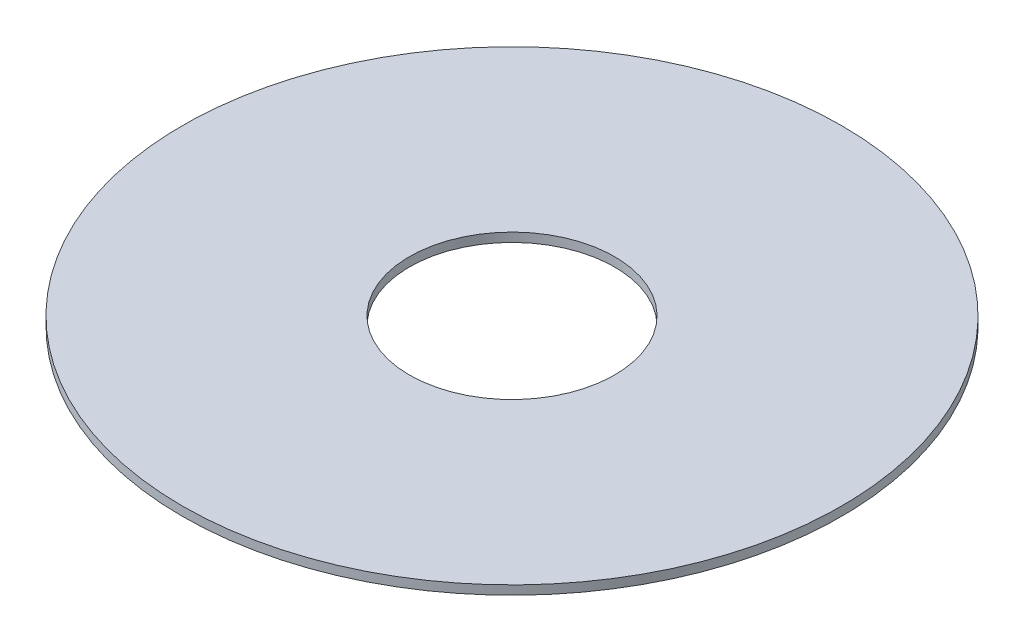
ISO-10303-21;
HEADER;
FILE_DESCRIPTION(('STEP AP214'),'2;1');
FILE_NAME('part.step','',(''),(''),'','','');
FILE_SCHEMA(('AUTOMOTIVE_DESIGN { 1 0 10303 214 1 1 1 1 }'));
ENDSEC;
DATA;
#1=APPLICATION_CONTEXT('core data for automotive mechanical design processes');
#2=APPLICATION_PROTOCOL_DEFINITION('international standard','automotive_design',2000,#1);
#3=PRODUCT_CONTEXT('',#1,'mechanical');
#4=PRODUCT('Part','Part','',(#3));
#5=PRODUCT_RELATED_PRODUCT_CATEGORY('part','',(#4));
#6=PRODUCT_DEFINITION_FORMATION('','',#4);
#7=PRODUCT_DEFINITION_CONTEXT('part definition',#1,'design');
#8=PRODUCT_DEFINITION('design','',#6,#7);
#9=PRODUCT_DEFINITION_SHAPE('','',#8);
#10=(LENGTH_UNIT() NAMED_UNIT(*) SI_UNIT(.MILLI.,.METRE.));
#11=(NAMED_UNIT(*) PLANE_ANGLE_UNIT() SI_UNIT($,.RADIAN.));
#12=(NAMED_UNIT(*) SI_UNIT($,.STERADIAN.) SOLID_ANGLE_UNIT());
#13=UNCERTAINTY_MEASURE_WITH_UNIT(LENGTH_MEASURE(1.E-05),#10,'distance_accuracy_value','');
#14=(GEOMETRIC_REPRESENTATION_CONTEXT(3) GLOBAL_UNCERTAINTY_ASSIGNED_CONTEXT((#13)) GLOBAL_UNIT_ASSIGNED_CONTEXT((#10,
#11,#12)) REPRESENTATION_CONTEXT('',''));
#15=CARTESIAN_POINT('',(0.,0.,0.));
#16=DIRECTION('',(0.,0.,1.));
#17=DIRECTION('',(1.,0.,0.));
#18=AXIS2_PLACEMENT_3D('',#15,#16,#17);
#19=CARTESIAN_POINT('',(0.,0.35,0.));
#20=DIRECTION('',(0.,1.,0.));
#21=DIRECTION('',(0.,0.,1.));
#22=AXIS2_PLACEMENT_3D('',#19,#20,#21);
#23=PLANE('',#22);
#24=CARTESIAN_POINT('',(0.,0.35,0.));
#25=DIRECTION('',(0.,1.,0.));
#26=DIRECTION('',(0.,0.,1.));
#27=AXIS2_PLACEMENT_3D('',#24,#25,#26);
#28=CIRCLE('',#27,12.85);
#29=CARTESIAN_POINT('',(0.,0.35,12.85));
#30=VERTEX_POINT('',#29);
#31=EDGE_CURVE('E11',#30,#30,#28,.T.);
#32=ORIENTED_EDGE('',*,*,#31,.T.);
#33=EDGE_LOOP('',(#32));
#34=FACE_BOUND('',#33,.T.);
#35=CARTESIAN_POINT('',(0.,0.35,0.));
#36=DIRECTION('',(0.,1.,0.));
#37=DIRECTION('',(0.,0.,1.));
#38=AXIS2_PLACEMENT_3D('',#35,#36,#37);
#39=CIRCLE('',#38,4.);
#40=CARTESIAN_POINT('',(0.,0.35,4.));
#41=VERTEX_POINT('',#40);
#42=EDGE_CURVE('E56',#41,#41,#39,.T.);
#43=ORIENTED_EDGE('',*,*,#42,.F.);
#44=EDGE_LOOP('',(#43));
#45=FACE_BOUND('',#44,.T.);
#46=ADVANCED_FACE('F43',(#34,#45),#23,.T.);
#47=CARTESIAN_POINT('',(0.,0.,0.));
#48=DIRECTION('',(0.,1.,0.));
#49=DIRECTION('',(0.,0.,1.));
#50=AXIS2_PLACEMENT_3D('',#47,#48,#49);
#51=PLANE('',#50);
#52=CARTESIAN_POINT('',(0.,0.,0.));
#53=DIRECTION('',(0.,1.,0.));
#54=DIRECTION('',(0.,0.,1.));
#55=AXIS2_PLACEMENT_3D('',#52,#53,#54);
#56=CIRCLE('',#55,12.85);
#57=CARTESIAN_POINT('',(0.,0.,12.85));
#58=VERTEX_POINT('',#57);
#59=EDGE_CURVE('E47',#58,#58,#56,.T.);
#60=ORIENTED_EDGE('',*,*,#59,.F.);
#61=EDGE_LOOP('',(#60));
#62=FACE_BOUND('',#61,.T.);
#63=CARTESIAN_POINT('',(0.,0.,0.));
#64=DIRECTION('',(0.,1.,0.));
#65=DIRECTION('',(0.,0.,1.));
#66=AXIS2_PLACEMENT_3D('',#63,#64,#65);
#67=CIRCLE('',#66,4.);
#68=CARTESIAN_POINT('',(0.,0.,4.));
#69=VERTEX_POINT('',#68);
#70=EDGE_CURVE('E58',#69,#69,#67,.T.);
#71=ORIENTED_EDGE('',*,*,#70,.T.);
#72=EDGE_LOOP('',(#71));
#73=FACE_BOUND('',#72,.T.);
#74=ADVANCED_FACE('F70',(#62,#73),#51,.F.);
#75=CARTESIAN_POINT('',(0.,0.35,0.));
#76=DIRECTION('',(0.,-1.,0.));
#77=DIRECTION('',(0.,0.,-1.));
#78=AXIS2_PLACEMENT_3D('',#75,#76,#77);
#79=CYLINDRICAL_SURFACE('',#78,12.85);
#80=ORIENTED_EDGE('',*,*,#31,.F.);
#81=EDGE_LOOP('',(#80));
#82=FACE_BOUND('',#81,.T.);
#83=ORIENTED_EDGE('',*,*,#59,.T.);
#84=EDGE_LOOP('',(#83));
#85=FACE_BOUND('',#84,.T.);
#86=ADVANCED_FACE('F45',(#82,#85),#79,.T.);
#87=CARTESIAN_POINT('',(0.,0.35,0.));
#88=DIRECTION('',(0.,-1.,0.));
#89=DIRECTION('',(0.,0.,-1.));
#90=AXIS2_PLACEMENT_3D('',#87,#88,#89);
#91=CYLINDRICAL_SURFACE('',#90,4.);
#92=ORIENTED_EDGE('',*,*,#42,.T.);
#93=EDGE_LOOP('',(#92));
#94=FACE_BOUND('',#93,.T.);
#95=ORIENTED_EDGE('',*,*,#70,.F.);
#96=EDGE_LOOP('',(#95));
#97=FACE_BOUND('',#96,.T.);
#98=ADVANCED_FACE('F66',(#94,#97),#91,.F.);
#99=CLOSED_SHELL('',(#46,#74,#86,#98));
#100=MANIFOLD_SOLID_BREP('B2',#99);
#101=ADVANCED_BREP_SHAPE_REPRESENTATION('',(#18,#100),#14);
#102=SHAPE_DEFINITION_REPRESENTATION(#9,#101);
ENDSEC;
END-ISO-10303-21;
